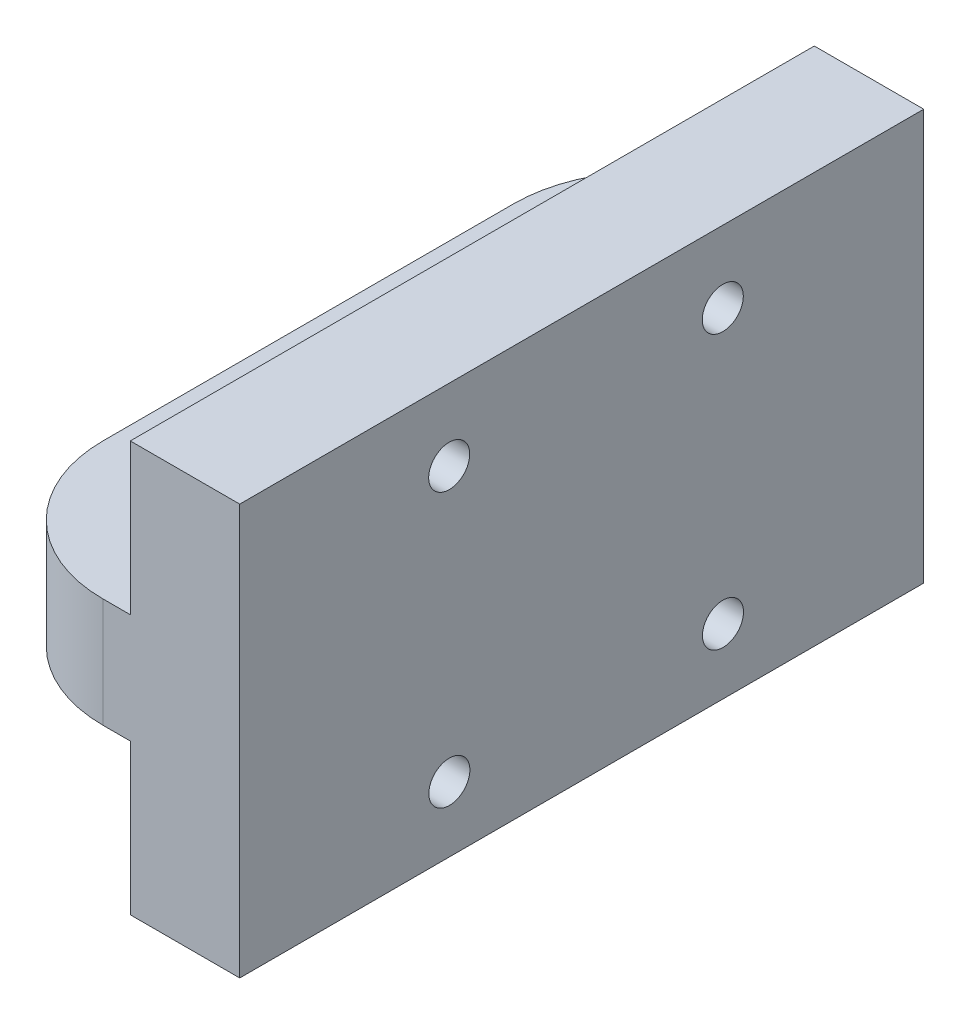
ISO-10303-21;
HEADER;
FILE_DESCRIPTION(('STEP AP214'),'2;1');
FILE_NAME('part.step','',(''),(''),'','','');
FILE_SCHEMA(('AUTOMOTIVE_DESIGN { 1 0 10303 214 1 1 1 1 }'));
ENDSEC;
DATA;
#1=APPLICATION_CONTEXT('core data for automotive mechanical design processes');
#2=APPLICATION_PROTOCOL_DEFINITION('international standard','automotive_design',2000,#1);
#3=PRODUCT_CONTEXT('',#1,'mechanical');
#4=PRODUCT('Part','Part','',(#3));
#5=PRODUCT_RELATED_PRODUCT_CATEGORY('part','',(#4));
#6=PRODUCT_DEFINITION_FORMATION('','',#4);
#7=PRODUCT_DEFINITION_CONTEXT('part definition',#1,'design');
#8=PRODUCT_DEFINITION('design','',#6,#7);
#9=PRODUCT_DEFINITION_SHAPE('','',#8);
#10=(LENGTH_UNIT() NAMED_UNIT(*) SI_UNIT(.MILLI.,.METRE.));
#11=(NAMED_UNIT(*) PLANE_ANGLE_UNIT() SI_UNIT($,.RADIAN.));
#12=(NAMED_UNIT(*) SI_UNIT($,.STERADIAN.) SOLID_ANGLE_UNIT());
#13=UNCERTAINTY_MEASURE_WITH_UNIT(LENGTH_MEASURE(1.E-05),#10,'distance_accuracy_value','');
#14=(GEOMETRIC_REPRESENTATION_CONTEXT(3) GLOBAL_UNCERTAINTY_ASSIGNED_CONTEXT((#13)) GLOBAL_UNIT_ASSIGNED_CONTEXT((#10,
#11,#12)) REPRESENTATION_CONTEXT('',''));
#15=CARTESIAN_POINT('',(0.,0.,0.));
#16=DIRECTION('',(0.,0.,1.));
#17=DIRECTION('',(1.,0.,0.));
#18=AXIS2_PLACEMENT_3D('',#15,#16,#17);
#19=CARTESIAN_POINT('',(0.,8.,0.));
#20=DIRECTION('',(0.,-1.,0.));
#21=DIRECTION('',(0.,0.,-1.));
#22=AXIS2_PLACEMENT_3D('',#19,#20,#21);
#23=PLANE('',#22);
#24=DIRECTION('',(0.,0.,1.));
#25=VECTOR('',#24,1.);
#26=CARTESIAN_POINT('',(12.,8.,0.));
#27=LINE('',#26,#25);
#28=CARTESIAN_POINT('',(12.,8.,-50.));
#29=VERTEX_POINT('',#28);
#30=CARTESIAN_POINT('',(12.,8.,0.));
#31=VERTEX_POINT('',#30);
#32=EDGE_CURVE('E65',#29,#31,#27,.T.);
#33=ORIENTED_EDGE('',*,*,#32,.F.);
#34=DIRECTION('',(-1.,0.,0.));
#35=VECTOR('',#34,1.);
#36=CARTESIAN_POINT('',(0.,8.,-50.));
#37=LINE('',#36,#35);
#38=CARTESIAN_POINT('',(10.,8.,-50.));
#39=VERTEX_POINT('',#38);
#40=EDGE_CURVE('E189',#29,#39,#37,.T.);
#41=ORIENTED_EDGE('',*,*,#40,.T.);
#42=CARTESIAN_POINT('',(10.,8.,-40.));
#43=DIRECTION('',(0.,-1.,0.));
#44=DIRECTION('',(0.,0.,-1.));
#45=AXIS2_PLACEMENT_3D('',#42,#43,#44);
#46=CIRCLE('',#45,10.);
#47=CARTESIAN_POINT('',(0.,8.,-40.));
#48=VERTEX_POINT('',#47);
#49=EDGE_CURVE('E226',#39,#48,#46,.F.);
#50=ORIENTED_EDGE('',*,*,#49,.T.);
#51=DIRECTION('',(0.,0.,1.));
#52=VECTOR('',#51,1.);
#53=CARTESIAN_POINT('',(0.,8.,0.));
#54=LINE('',#53,#52);
#55=CARTESIAN_POINT('',(0.,8.,-10.));
#56=VERTEX_POINT('',#55);
#57=EDGE_CURVE('E182',#48,#56,#54,.T.);
#58=ORIENTED_EDGE('',*,*,#57,.T.);
#59=CARTESIAN_POINT('',(10.,8.,-10.));
#60=DIRECTION('',(0.,-1.,0.));
#61=DIRECTION('',(0.,0.,-1.));
#62=AXIS2_PLACEMENT_3D('',#59,#60,#61);
#63=CIRCLE('',#62,10.);
#64=CARTESIAN_POINT('',(10.,8.,0.));
#65=VERTEX_POINT('',#64);
#66=EDGE_CURVE('E223',#56,#65,#63,.F.);
#67=ORIENTED_EDGE('',*,*,#66,.T.);
#68=DIRECTION('',(1.,0.,0.));
#69=VECTOR('',#68,1.);
#70=CARTESIAN_POINT('',(0.,8.,0.));
#71=LINE('',#70,#69);
#72=EDGE_CURVE('E61',#65,#31,#71,.T.);
#73=ORIENTED_EDGE('',*,*,#72,.T.);
#74=EDGE_LOOP('',(#33,#41,#50,#58,#67,#73));
#75=FACE_BOUND('',#74,.T.);
#76=ADVANCED_FACE('F45',(#75),#23,.F.);
#77=CARTESIAN_POINT('',(0.,0.,0.));
#78=DIRECTION('',(0.,-1.,0.));
#79=DIRECTION('',(0.,0.,-1.));
#80=AXIS2_PLACEMENT_3D('',#77,#78,#79);
#81=PLANE('',#80);
#82=DIRECTION('',(-1.,0.,0.));
#83=VECTOR('',#82,1.);
#84=CARTESIAN_POINT('',(0.,0.,-50.));
#85=LINE('',#84,#83);
#86=CARTESIAN_POINT('',(12.,0.,-50.));
#87=VERTEX_POINT('',#86);
#88=CARTESIAN_POINT('',(10.,0.,-50.));
#89=VERTEX_POINT('',#88);
#90=EDGE_CURVE('E186',#87,#89,#85,.T.);
#91=ORIENTED_EDGE('',*,*,#90,.F.);
#92=DIRECTION('',(0.,0.,1.));
#93=VECTOR('',#92,1.);
#94=CARTESIAN_POINT('',(12.,0.,0.));
#95=LINE('',#94,#93);
#96=CARTESIAN_POINT('',(12.,0.,0.));
#97=VERTEX_POINT('',#96);
#98=EDGE_CURVE('E11',#87,#97,#95,.T.);
#99=ORIENTED_EDGE('',*,*,#98,.T.);
#100=DIRECTION('',(1.,0.,0.));
#101=VECTOR('',#100,1.);
#102=CARTESIAN_POINT('',(0.,0.,0.));
#103=LINE('',#102,#101);
#104=CARTESIAN_POINT('',(10.,0.,0.));
#105=VERTEX_POINT('',#104);
#106=EDGE_CURVE('E128',#105,#97,#103,.T.);
#107=ORIENTED_EDGE('',*,*,#106,.F.);
#108=CARTESIAN_POINT('',(10.,0.,-10.));
#109=DIRECTION('',(0.,-1.,0.));
#110=DIRECTION('',(0.,0.,-1.));
#111=AXIS2_PLACEMENT_3D('',#108,#109,#110);
#112=CIRCLE('',#111,10.);
#113=CARTESIAN_POINT('',(0.,0.,-10.));
#114=VERTEX_POINT('',#113);
#115=EDGE_CURVE('E212',#105,#114,#112,.T.);
#116=ORIENTED_EDGE('',*,*,#115,.T.);
#117=DIRECTION('',(0.,0.,1.));
#118=VECTOR('',#117,1.);
#119=CARTESIAN_POINT('',(0.,0.,0.));
#120=LINE('',#119,#118);
#121=CARTESIAN_POINT('',(0.,0.,-40.));
#122=VERTEX_POINT('',#121);
#123=EDGE_CURVE('E181',#122,#114,#120,.T.);
#124=ORIENTED_EDGE('',*,*,#123,.F.);
#125=CARTESIAN_POINT('',(10.,0.,-40.));
#126=DIRECTION('',(0.,-1.,0.));
#127=DIRECTION('',(0.,0.,-1.));
#128=AXIS2_PLACEMENT_3D('',#125,#126,#127);
#129=CIRCLE('',#128,10.);
#130=EDGE_CURVE('E215',#122,#89,#129,.T.);
#131=ORIENTED_EDGE('',*,*,#130,.T.);
#132=EDGE_LOOP('',(#91,#99,#107,#116,#124,#131));
#133=FACE_BOUND('',#132,.T.);
#134=ADVANCED_FACE('F234',(#133),#81,.T.);
#135=CARTESIAN_POINT('',(0.,8.,0.));
#136=DIRECTION('',(1.,0.,0.));
#137=DIRECTION('',(0.,0.,-1.));
#138=AXIS2_PLACEMENT_3D('',#135,#136,#137);
#139=PLANE('',#138);
#140=ORIENTED_EDGE('',*,*,#57,.F.);
#141=DIRECTION('',(0.,-1.,0.));
#142=VECTOR('',#141,1.);
#143=CARTESIAN_POINT('',(0.,8.,-40.));
#144=LINE('',#143,#142);
#145=EDGE_CURVE('E208',#48,#122,#144,.T.);
#146=ORIENTED_EDGE('',*,*,#145,.T.);
#147=ORIENTED_EDGE('',*,*,#123,.T.);
#148=DIRECTION('',(0.,-1.,0.));
#149=VECTOR('',#148,1.);
#150=CARTESIAN_POINT('',(0.,8.,-10.));
#151=LINE('',#150,#149);
#152=EDGE_CURVE('E205',#114,#56,#151,.F.);
#153=ORIENTED_EDGE('',*,*,#152,.T.);
#154=EDGE_LOOP('',(#140,#146,#147,#153));
#155=FACE_BOUND('',#154,.T.);
#156=ADVANCED_FACE('F255',(#155),#139,.F.);
#157=CARTESIAN_POINT('',(0.,8.,0.));
#158=DIRECTION('',(0.,0.,-1.));
#159=DIRECTION('',(-1.,0.,0.));
#160=AXIS2_PLACEMENT_3D('',#157,#158,#159);
#161=PLANE('',#160);
#162=DIRECTION('',(0.,-1.,0.));
#163=VECTOR('',#162,1.);
#164=CARTESIAN_POINT('',(20.,8.,0.));
#165=LINE('',#164,#163);
#166=CARTESIAN_POINT('',(20.,19.,0.));
#167=VERTEX_POINT('',#166);
#168=CARTESIAN_POINT('',(20.,-11.,0.));
#169=VERTEX_POINT('',#168);
#170=EDGE_CURVE('E202',#167,#169,#165,.T.);
#171=ORIENTED_EDGE('',*,*,#170,.F.);
#172=DIRECTION('',(1.,0.,0.));
#173=VECTOR('',#172,1.);
#174=CARTESIAN_POINT('',(12.,19.,0.));
#175=LINE('',#174,#173);
#176=CARTESIAN_POINT('',(12.,19.,0.));
#177=VERTEX_POINT('',#176);
#178=EDGE_CURVE('E169',#177,#167,#175,.T.);
#179=ORIENTED_EDGE('',*,*,#178,.F.);
#180=DIRECTION('',(0.,-1.,0.));
#181=VECTOR('',#180,1.);
#182=CARTESIAN_POINT('',(12.,19.,0.));
#183=LINE('',#182,#181);
#184=EDGE_CURVE('E132',#177,#31,#183,.T.);
#185=ORIENTED_EDGE('',*,*,#184,.T.);
#186=ORIENTED_EDGE('',*,*,#72,.F.);
#187=DIRECTION('',(0.,-1.,0.));
#188=VECTOR('',#187,1.);
#189=CARTESIAN_POINT('',(10.,8.,0.));
#190=LINE('',#189,#188);
#191=EDGE_CURVE('E54',#65,#105,#190,.T.);
#192=ORIENTED_EDGE('',*,*,#191,.T.);
#193=ORIENTED_EDGE('',*,*,#106,.T.);
#194=CARTESIAN_POINT('',(12.,-11.,0.));
#195=VERTEX_POINT('',#194);
#196=EDGE_CURVE('E121',#97,#195,#183,.T.);
#197=ORIENTED_EDGE('',*,*,#196,.T.);
#198=DIRECTION('',(1.,0.,0.));
#199=VECTOR('',#198,1.);
#200=CARTESIAN_POINT('',(12.,-11.,0.));
#201=LINE('',#200,#199);
#202=EDGE_CURVE('E124',#195,#169,#201,.T.);
#203=ORIENTED_EDGE('',*,*,#202,.T.);
#204=EDGE_LOOP('',(#171,#179,#185,#186,#192,#193,#197,#203));
#205=FACE_BOUND('',#204,.T.);
#206=ADVANCED_FACE('F123',(#205),#161,.F.);
#207=CARTESIAN_POINT('',(20.,8.,0.));
#208=DIRECTION('',(-1.,0.,0.));
#209=DIRECTION('',(0.,0.,1.));
#210=AXIS2_PLACEMENT_3D('',#207,#208,#209);
#211=PLANE('',#210);
#212=CARTESIAN_POINT('',(20.,-6.23942734027261,-15.3243158285808));
#213=DIRECTION('',(1.,0.,0.));
#214=DIRECTION('',(0.,0.,-1.));
#215=AXIS2_PLACEMENT_3D('',#212,#213,#214);
#216=CIRCLE('',#215,1.5);
#217=CARTESIAN_POINT('',(20.,-6.23942734027261,-16.8243158285808));
#218=VERTEX_POINT('',#217);
#219=EDGE_CURVE('E404',#218,#218,#216,.T.);
#220=ORIENTED_EDGE('',*,*,#219,.F.);
#221=EDGE_LOOP('',(#220));
#222=FACE_BOUND('',#221,.T.);
#223=CARTESIAN_POINT('',(20.,13.7605688514047,-35.31197350739));
#224=DIRECTION('',(1.,0.,0.));
#225=DIRECTION('',(0.,0.,-1.));
#226=AXIS2_PLACEMENT_3D('',#223,#224,#225);
#227=CIRCLE('',#226,1.5);
#228=CARTESIAN_POINT('',(20.,13.7605688514047,-36.81197350739));
#229=VERTEX_POINT('',#228);
#230=EDGE_CURVE('E411',#229,#229,#227,.T.);
#231=ORIENTED_EDGE('',*,*,#230,.F.);
#232=EDGE_LOOP('',(#231));
#233=FACE_BOUND('',#232,.T.);
#234=CARTESIAN_POINT('',(20.,-6.23942734027261,-35.3243158285808));
#235=DIRECTION('',(1.,0.,0.));
#236=DIRECTION('',(0.,0.,-1.));
#237=AXIS2_PLACEMENT_3D('',#234,#235,#236);
#238=CIRCLE('',#237,1.5);
#239=CARTESIAN_POINT('',(20.,-6.23942734027261,-36.8243158285808));
#240=VERTEX_POINT('',#239);
#241=EDGE_CURVE('E424',#240,#240,#238,.T.);
#242=ORIENTED_EDGE('',*,*,#241,.F.);
#243=EDGE_LOOP('',(#242));
#244=FACE_BOUND('',#243,.T.);
#245=CARTESIAN_POINT('',(20.,13.7605688514047,-15.31197350739));
#246=DIRECTION('',(1.,0.,0.));
#247=DIRECTION('',(0.,0.,-1.));
#248=AXIS2_PLACEMENT_3D('',#245,#246,#247);
#249=CIRCLE('',#248,1.5);
#250=CARTESIAN_POINT('',(20.,13.7605688514047,-16.81197350739));
#251=VERTEX_POINT('',#250);
#252=EDGE_CURVE('E406',#251,#251,#249,.T.);
#253=ORIENTED_EDGE('',*,*,#252,.F.);
#254=EDGE_LOOP('',(#253));
#255=FACE_BOUND('',#254,.T.);
#256=ORIENTED_EDGE('',*,*,#170,.T.);
#257=DIRECTION('',(0.,0.,-1.));
#258=VECTOR('',#257,1.);
#259=CARTESIAN_POINT('',(20.,-11.,0.));
#260=LINE('',#259,#258);
#261=CARTESIAN_POINT('',(20.,-11.,-50.));
#262=VERTEX_POINT('',#261);
#263=EDGE_CURVE('E141',#169,#262,#260,.T.);
#264=ORIENTED_EDGE('',*,*,#263,.T.);
#265=DIRECTION('',(0.,-1.,0.));
#266=VECTOR('',#265,1.);
#267=CARTESIAN_POINT('',(20.,8.,-50.));
#268=LINE('',#267,#266);
#269=CARTESIAN_POINT('',(20.,19.,-50.));
#270=VERTEX_POINT('',#269);
#271=EDGE_CURVE('E192',#270,#262,#268,.T.);
#272=ORIENTED_EDGE('',*,*,#271,.F.);
#273=DIRECTION('',(0.,0.,1.));
#274=VECTOR('',#273,1.);
#275=CARTESIAN_POINT('',(20.,19.,0.));
#276=LINE('',#275,#274);
#277=EDGE_CURVE('E133',#270,#167,#276,.T.);
#278=ORIENTED_EDGE('',*,*,#277,.T.);
#279=EDGE_LOOP('',(#256,#264,#272,#278));
#280=FACE_BOUND('',#279,.T.);
#281=ADVANCED_FACE('F239',(#222,#233,#244,#255,#280),#211,.F.);
#282=CARTESIAN_POINT('',(0.,8.,-50.));
#283=DIRECTION('',(0.,0.,1.));
#284=DIRECTION('',(1.,0.,0.));
#285=AXIS2_PLACEMENT_3D('',#282,#283,#284);
#286=PLANE('',#285);
#287=ORIENTED_EDGE('',*,*,#271,.T.);
#288=DIRECTION('',(1.,0.,0.));
#289=VECTOR('',#288,1.);
#290=CARTESIAN_POINT('',(12.,-11.,-50.));
#291=LINE('',#290,#289);
#292=CARTESIAN_POINT('',(12.,-11.,-50.));
#293=VERTEX_POINT('',#292);
#294=EDGE_CURVE('E143',#293,#262,#291,.T.);
#295=ORIENTED_EDGE('',*,*,#294,.F.);
#296=DIRECTION('',(0.,1.,0.));
#297=VECTOR('',#296,1.);
#298=CARTESIAN_POINT('',(12.,19.,-50.));
#299=LINE('',#298,#297);
#300=EDGE_CURVE('E149',#293,#87,#299,.T.);
#301=ORIENTED_EDGE('',*,*,#300,.T.);
#302=ORIENTED_EDGE('',*,*,#90,.T.);
#303=DIRECTION('',(0.,-1.,0.));
#304=VECTOR('',#303,1.);
#305=CARTESIAN_POINT('',(10.,8.,-50.));
#306=LINE('',#305,#304);
#307=EDGE_CURVE('E219',#89,#39,#306,.F.);
#308=ORIENTED_EDGE('',*,*,#307,.T.);
#309=ORIENTED_EDGE('',*,*,#40,.F.);
#310=CARTESIAN_POINT('',(12.,19.,-50.));
#311=VERTEX_POINT('',#310);
#312=EDGE_CURVE('E151',#29,#311,#299,.T.);
#313=ORIENTED_EDGE('',*,*,#312,.T.);
#314=DIRECTION('',(1.,0.,0.));
#315=VECTOR('',#314,1.);
#316=CARTESIAN_POINT('',(12.,19.,-50.));
#317=LINE('',#316,#315);
#318=EDGE_CURVE('E173',#311,#270,#317,.T.);
#319=ORIENTED_EDGE('',*,*,#318,.T.);
#320=EDGE_LOOP('',(#287,#295,#301,#302,#308,#309,#313,#319));
#321=FACE_BOUND('',#320,.T.);
#322=ADVANCED_FACE('F237',(#321),#286,.F.);
#323=CARTESIAN_POINT('',(10.,8.,-40.));
#324=DIRECTION('',(0.,-1.,0.));
#325=DIRECTION('',(0.,0.,-1.));
#326=AXIS2_PLACEMENT_3D('',#323,#324,#325);
#327=CYLINDRICAL_SURFACE('',#326,10.);
#328=ORIENTED_EDGE('',*,*,#49,.F.);
#329=ORIENTED_EDGE('',*,*,#307,.F.);
#330=ORIENTED_EDGE('',*,*,#130,.F.);
#331=ORIENTED_EDGE('',*,*,#145,.F.);
#332=EDGE_LOOP('',(#328,#329,#330,#331));
#333=FACE_BOUND('',#332,.T.);
#334=ADVANCED_FACE('F257',(#333),#327,.T.);
#335=CARTESIAN_POINT('',(10.,8.,-10.));
#336=DIRECTION('',(0.,-1.,0.));
#337=DIRECTION('',(0.,0.,-1.));
#338=AXIS2_PLACEMENT_3D('',#335,#336,#337);
#339=CYLINDRICAL_SURFACE('',#338,10.);
#340=ORIENTED_EDGE('',*,*,#66,.F.);
#341=ORIENTED_EDGE('',*,*,#152,.F.);
#342=ORIENTED_EDGE('',*,*,#115,.F.);
#343=ORIENTED_EDGE('',*,*,#191,.F.);
#344=EDGE_LOOP('',(#340,#341,#342,#343));
#345=FACE_BOUND('',#344,.T.);
#346=ADVANCED_FACE('F47',(#345),#339,.T.);
#347=CARTESIAN_POINT('',(12.,-11.,0.));
#348=DIRECTION('',(0.,-1.,0.));
#349=DIRECTION('',(0.,0.,-1.));
#350=AXIS2_PLACEMENT_3D('',#347,#348,#349);
#351=PLANE('',#350);
#352=ORIENTED_EDGE('',*,*,#263,.F.);
#353=ORIENTED_EDGE('',*,*,#202,.F.);
#354=DIRECTION('',(0.,0.,-1.));
#355=VECTOR('',#354,1.);
#356=CARTESIAN_POINT('',(12.,-11.,0.));
#357=LINE('',#356,#355);
#358=EDGE_CURVE('E139',#195,#293,#357,.T.);
#359=ORIENTED_EDGE('',*,*,#358,.T.);
#360=ORIENTED_EDGE('',*,*,#294,.T.);
#361=EDGE_LOOP('',(#352,#353,#359,#360));
#362=FACE_BOUND('',#361,.T.);
#363=ADVANCED_FACE('F137',(#362),#351,.T.);
#364=CARTESIAN_POINT('',(12.,0.,0.));
#365=DIRECTION('',(1.,0.,0.));
#366=DIRECTION('',(0.,0.,-1.));
#367=AXIS2_PLACEMENT_3D('',#364,#365,#366);
#368=PLANE('',#367);
#369=CARTESIAN_POINT('',(12.,-6.23942734027261,-15.3243158285808));
#370=DIRECTION('',(1.,0.,0.));
#371=DIRECTION('',(0.,0.,-1.));
#372=AXIS2_PLACEMENT_3D('',#369,#370,#371);
#373=CIRCLE('',#372,1.5);
#374=CARTESIAN_POINT('',(12.,-6.23942734027261,-16.8243158285808));
#375=VERTEX_POINT('',#374);
#376=EDGE_CURVE('E401',#375,#375,#373,.T.);
#377=ORIENTED_EDGE('',*,*,#376,.T.);
#378=EDGE_LOOP('',(#377));
#379=FACE_BOUND('',#378,.T.);
#380=CARTESIAN_POINT('',(12.,-6.23942734027261,-35.3243158285808));
#381=DIRECTION('',(1.,0.,0.));
#382=DIRECTION('',(0.,0.,-1.));
#383=AXIS2_PLACEMENT_3D('',#380,#381,#382);
#384=CIRCLE('',#383,1.5);
#385=CARTESIAN_POINT('',(12.,-6.23942734027261,-36.8243158285808));
#386=VERTEX_POINT('',#385);
#387=EDGE_CURVE('E414',#386,#386,#384,.T.);
#388=ORIENTED_EDGE('',*,*,#387,.T.);
#389=EDGE_LOOP('',(#388));
#390=FACE_BOUND('',#389,.T.);
#391=ORIENTED_EDGE('',*,*,#98,.F.);
#392=ORIENTED_EDGE('',*,*,#300,.F.);
#393=ORIENTED_EDGE('',*,*,#358,.F.);
#394=ORIENTED_EDGE('',*,*,#196,.F.);
#395=EDGE_LOOP('',(#391,#392,#393,#394));
#396=FACE_BOUND('',#395,.T.);
#397=ADVANCED_FACE('F147',(#379,#390,#396),#368,.F.);
#398=CARTESIAN_POINT('',(12.,13.7605688514047,-35.31197350739));
#399=DIRECTION('',(1.,0.,0.));
#400=DIRECTION('',(0.,0.,-1.));
#401=AXIS2_PLACEMENT_3D('',#398,#399,#400);
#402=CIRCLE('',#401,1.5);
#403=CARTESIAN_POINT('',(12.,13.7605688514047,-36.81197350739));
#404=VERTEX_POINT('',#403);
#405=EDGE_CURVE('E420',#404,#404,#402,.T.);
#406=ORIENTED_EDGE('',*,*,#405,.T.);
#407=EDGE_LOOP('',(#406));
#408=FACE_BOUND('',#407,.T.);
#409=CARTESIAN_POINT('',(12.,13.7605688514047,-15.31197350739));
#410=DIRECTION('',(1.,0.,0.));
#411=DIRECTION('',(0.,0.,-1.));
#412=AXIS2_PLACEMENT_3D('',#409,#410,#411);
#413=CIRCLE('',#412,1.5);
#414=CARTESIAN_POINT('',(12.,13.7605688514047,-16.81197350739));
#415=VERTEX_POINT('',#414);
#416=EDGE_CURVE('E165',#415,#415,#413,.T.);
#417=ORIENTED_EDGE('',*,*,#416,.T.);
#418=EDGE_LOOP('',(#417));
#419=FACE_BOUND('',#418,.T.);
#420=ORIENTED_EDGE('',*,*,#312,.F.);
#421=ORIENTED_EDGE('',*,*,#32,.T.);
#422=ORIENTED_EDGE('',*,*,#184,.F.);
#423=DIRECTION('',(0.,0.,1.));
#424=VECTOR('',#423,1.);
#425=CARTESIAN_POINT('',(12.,19.,0.));
#426=LINE('',#425,#424);
#427=EDGE_CURVE('E144',#311,#177,#426,.T.);
#428=ORIENTED_EDGE('',*,*,#427,.F.);
#429=EDGE_LOOP('',(#420,#421,#422,#428));
#430=FACE_BOUND('',#429,.T.);
#431=ADVANCED_FACE('F248',(#408,#419,#430),#368,.F.);
#432=CARTESIAN_POINT('',(12.,19.,0.));
#433=DIRECTION('',(0.,1.,0.));
#434=DIRECTION('',(0.,0.,1.));
#435=AXIS2_PLACEMENT_3D('',#432,#433,#434);
#436=PLANE('',#435);
#437=ORIENTED_EDGE('',*,*,#277,.F.);
#438=ORIENTED_EDGE('',*,*,#318,.F.);
#439=ORIENTED_EDGE('',*,*,#427,.T.);
#440=ORIENTED_EDGE('',*,*,#178,.T.);
#441=EDGE_LOOP('',(#437,#438,#439,#440));
#442=FACE_BOUND('',#441,.T.);
#443=ADVANCED_FACE('F243',(#442),#436,.T.);
#444=CARTESIAN_POINT('',(12.,13.7605688514047,-15.31197350739));
#445=DIRECTION('',(1.,0.,0.));
#446=DIRECTION('',(0.,0.,-1.));
#447=AXIS2_PLACEMENT_3D('',#444,#445,#446);
#448=CYLINDRICAL_SURFACE('',#447,1.5);
#449=ORIENTED_EDGE('',*,*,#416,.F.);
#450=EDGE_LOOP('',(#449));
#451=FACE_BOUND('',#450,.T.);
#452=ORIENTED_EDGE('',*,*,#252,.T.);
#453=EDGE_LOOP('',(#452));
#454=FACE_BOUND('',#453,.T.);
#455=ADVANCED_FACE('F358',(#451,#454),#448,.F.);
#456=CARTESIAN_POINT('',(12.,13.7605688514047,-35.31197350739));
#457=DIRECTION('',(1.,0.,0.));
#458=DIRECTION('',(0.,0.,-1.));
#459=AXIS2_PLACEMENT_3D('',#456,#457,#458);
#460=CYLINDRICAL_SURFACE('',#459,1.5);
#461=ORIENTED_EDGE('',*,*,#405,.F.);
#462=EDGE_LOOP('',(#461));
#463=FACE_BOUND('',#462,.T.);
#464=ORIENTED_EDGE('',*,*,#230,.T.);
#465=EDGE_LOOP('',(#464));
#466=FACE_BOUND('',#465,.T.);
#467=ADVANCED_FACE('F365',(#463,#466),#460,.F.);
#468=CARTESIAN_POINT('',(12.,-6.23942734027261,-35.3243158285808));
#469=DIRECTION('',(1.,0.,0.));
#470=DIRECTION('',(0.,0.,-1.));
#471=AXIS2_PLACEMENT_3D('',#468,#469,#470);
#472=CYLINDRICAL_SURFACE('',#471,1.5);
#473=ORIENTED_EDGE('',*,*,#387,.F.);
#474=EDGE_LOOP('',(#473));
#475=FACE_BOUND('',#474,.T.);
#476=ORIENTED_EDGE('',*,*,#241,.T.);
#477=EDGE_LOOP('',(#476));
#478=FACE_BOUND('',#477,.T.);
#479=ADVANCED_FACE('F375',(#475,#478),#472,.F.);
#480=CARTESIAN_POINT('',(12.,-6.23942734027261,-15.3243158285808));
#481=DIRECTION('',(1.,0.,0.));
#482=DIRECTION('',(0.,0.,-1.));
#483=AXIS2_PLACEMENT_3D('',#480,#481,#482);
#484=CYLINDRICAL_SURFACE('',#483,1.5);
#485=ORIENTED_EDGE('',*,*,#376,.F.);
#486=EDGE_LOOP('',(#485));
#487=FACE_BOUND('',#486,.T.);
#488=ORIENTED_EDGE('',*,*,#219,.T.);
#489=EDGE_LOOP('',(#488));
#490=FACE_BOUND('',#489,.T.);
#491=ADVANCED_FACE('F385',(#487,#490),#484,.F.);
#492=CLOSED_SHELL('',(#76,#134,#156,#206,#281,#322,#334,#346,#363,#397,#431,#443,#455,#467,#479,#491));
#493=MANIFOLD_SOLID_BREP('B2',#492);
#494=ADVANCED_BREP_SHAPE_REPRESENTATION('',(#18,#493),#14);
#495=SHAPE_DEFINITION_REPRESENTATION(#9,#494);
ENDSEC;
END-ISO-10303-21;
